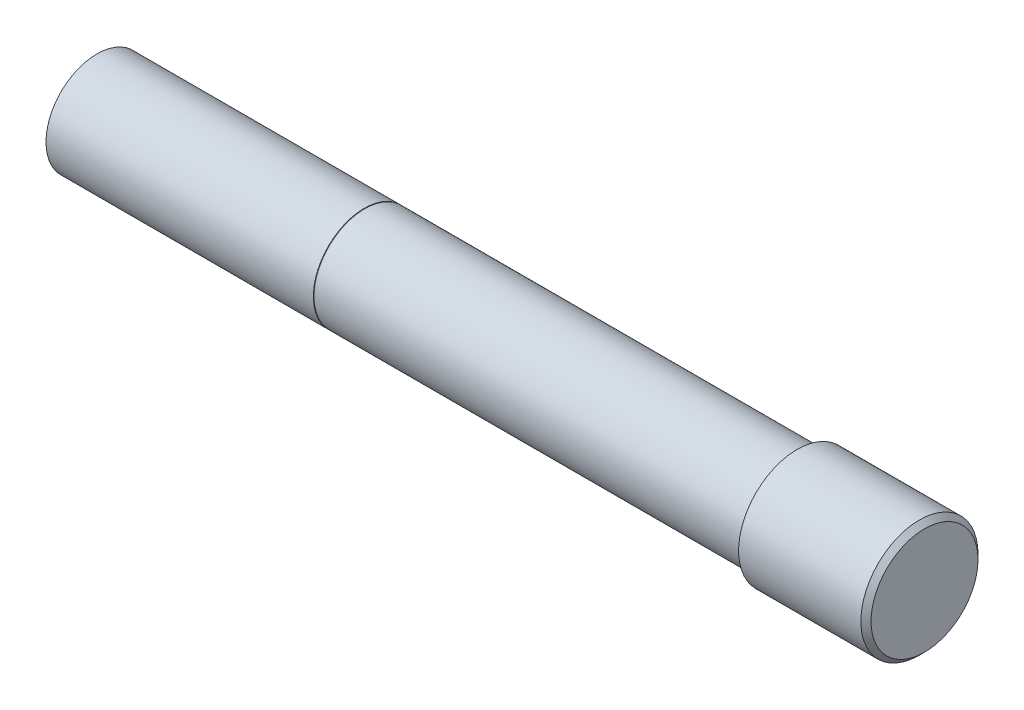
ISO-10303-21;
HEADER;
FILE_DESCRIPTION(('STEP AP214'),'2;1');
FILE_NAME('part.step','',(''),(''),'','','');
FILE_SCHEMA(('AUTOMOTIVE_DESIGN { 1 0 10303 214 1 1 1 1 }'));
ENDSEC;
DATA;
#1=APPLICATION_CONTEXT('core data for automotive mechanical design processes');
#2=APPLICATION_PROTOCOL_DEFINITION('international standard','automotive_design',2000,#1);
#3=PRODUCT_CONTEXT('',#1,'mechanical');
#4=PRODUCT('Part','Part','',(#3));
#5=PRODUCT_RELATED_PRODUCT_CATEGORY('part','',(#4));
#6=PRODUCT_DEFINITION_FORMATION('','',#4);
#7=PRODUCT_DEFINITION_CONTEXT('part definition',#1,'design');
#8=PRODUCT_DEFINITION('design','',#6,#7);
#9=PRODUCT_DEFINITION_SHAPE('','',#8);
#10=(LENGTH_UNIT() NAMED_UNIT(*) SI_UNIT(.MILLI.,.METRE.));
#11=(NAMED_UNIT(*) PLANE_ANGLE_UNIT() SI_UNIT($,.RADIAN.));
#12=(NAMED_UNIT(*) SI_UNIT($,.STERADIAN.) SOLID_ANGLE_UNIT());
#13=UNCERTAINTY_MEASURE_WITH_UNIT(LENGTH_MEASURE(1.E-05),#10,'distance_accuracy_value','');
#14=(GEOMETRIC_REPRESENTATION_CONTEXT(3) GLOBAL_UNCERTAINTY_ASSIGNED_CONTEXT((#13)) GLOBAL_UNIT_ASSIGNED_CONTEXT((#10,
#11,#12)) REPRESENTATION_CONTEXT('',''));
#15=CARTESIAN_POINT('',(0.,0.,0.));
#16=DIRECTION('',(0.,0.,1.));
#17=DIRECTION('',(1.,0.,0.));
#18=AXIS2_PLACEMENT_3D('',#15,#16,#17);
#19=CARTESIAN_POINT('',(0.,0.,0.));
#20=DIRECTION('',(1.,0.,0.));
#21=DIRECTION('',(0.,0.,-1.));
#22=AXIS2_PLACEMENT_3D('',#19,#20,#21);
#23=CYLINDRICAL_SURFACE('',#22,2.);
#24=CARTESIAN_POINT('',(11.,0.,0.));
#25=DIRECTION('',(1.,0.,0.));
#26=DIRECTION('',(0.,0.,-1.));
#27=AXIS2_PLACEMENT_3D('',#24,#25,#26);
#28=CIRCLE('',#27,2.);
#29=CARTESIAN_POINT('',(11.,0.,-2.));
#30=VERTEX_POINT('',#29);
#31=EDGE_CURVE('E64',#30,#30,#28,.T.);
#32=ORIENTED_EDGE('',*,*,#31,.F.);
#33=EDGE_LOOP('',(#32));
#34=FACE_BOUND('',#33,.T.);
#35=CARTESIAN_POINT('',(0.5,0.,0.));
#36=DIRECTION('',(-1.,0.,0.));
#37=DIRECTION('',(0.,0.,1.));
#38=AXIS2_PLACEMENT_3D('',#35,#36,#37);
#39=CIRCLE('',#38,2.);
#40=CARTESIAN_POINT('',(0.5,0.,2.));
#41=VERTEX_POINT('',#40);
#42=EDGE_CURVE('E39',#41,#41,#39,.F.);
#43=ORIENTED_EDGE('',*,*,#42,.T.);
#44=EDGE_LOOP('',(#43));
#45=FACE_BOUND('',#44,.T.);
#46=ADVANCED_FACE('F35',(#34,#45),#23,.T.);
#47=CARTESIAN_POINT('',(33.,0.,0.));
#48=DIRECTION('',(1.,0.,0.));
#49=DIRECTION('',(0.,0.,-1.));
#50=AXIS2_PLACEMENT_3D('',#47,#48,#49);
#51=PLANE('',#50);
#52=CARTESIAN_POINT('',(33.,0.,0.));
#53=DIRECTION('',(1.,0.,0.));
#54=DIRECTION('',(0.,0.,-1.));
#55=AXIS2_PLACEMENT_3D('',#52,#53,#54);
#56=CIRCLE('',#55,2.10000000000001);
#57=CARTESIAN_POINT('',(33.,0.,-2.10000000000001));
#58=VERTEX_POINT('',#57);
#59=EDGE_CURVE('E43',#58,#58,#56,.T.);
#60=ORIENTED_EDGE('',*,*,#59,.T.);
#61=EDGE_LOOP('',(#60));
#62=FACE_BOUND('',#61,.T.);
#63=ADVANCED_FACE('F82',(#62),#51,.T.);
#64=CARTESIAN_POINT('',(0.,0.,0.));
#65=DIRECTION('',(1.,0.,0.));
#66=DIRECTION('',(0.,0.,-1.));
#67=AXIS2_PLACEMENT_3D('',#64,#65,#66);
#68=CYLINDRICAL_SURFACE('',#67,2.3);
#69=CARTESIAN_POINT('',(32.8,0.,0.));
#70=DIRECTION('',(1.,0.,0.));
#71=DIRECTION('',(0.,0.,-1.));
#72=AXIS2_PLACEMENT_3D('',#69,#70,#71);
#73=CIRCLE('',#72,2.3);
#74=CARTESIAN_POINT('',(32.8,0.,-2.3));
#75=VERTEX_POINT('',#74);
#76=EDGE_CURVE('E10',#75,#75,#73,.F.);
#77=ORIENTED_EDGE('',*,*,#76,.T.);
#78=EDGE_LOOP('',(#77));
#79=FACE_BOUND('',#78,.T.);
#80=CARTESIAN_POINT('',(28.,0.,0.));
#81=DIRECTION('',(1.,0.,0.));
#82=DIRECTION('',(0.,0.,-1.));
#83=AXIS2_PLACEMENT_3D('',#80,#81,#82);
#84=CIRCLE('',#83,2.3);
#85=CARTESIAN_POINT('',(28.,0.,-2.3));
#86=VERTEX_POINT('',#85);
#87=EDGE_CURVE('E47',#86,#86,#84,.T.);
#88=ORIENTED_EDGE('',*,*,#87,.T.);
#89=EDGE_LOOP('',(#88));
#90=FACE_BOUND('',#89,.T.);
#91=ADVANCED_FACE('F87',(#79,#90),#68,.T.);
#92=CARTESIAN_POINT('',(28.,0.,-2.3));
#93=DIRECTION('',(-1.,0.,0.));
#94=DIRECTION('',(0.,0.,1.));
#95=AXIS2_PLACEMENT_3D('',#92,#93,#94);
#96=PLANE('',#95);
#97=CARTESIAN_POINT('',(28.,0.,0.));
#98=DIRECTION('',(1.,0.,0.));
#99=DIRECTION('',(0.,0.,-1.));
#100=AXIS2_PLACEMENT_3D('',#97,#98,#99);
#101=CIRCLE('',#100,2.);
#102=CARTESIAN_POINT('',(28.,0.,-2.));
#103=VERTEX_POINT('',#102);
#104=EDGE_CURVE('E52',#103,#103,#101,.T.);
#105=ORIENTED_EDGE('',*,*,#104,.T.);
#106=EDGE_LOOP('',(#105));
#107=FACE_BOUND('',#106,.T.);
#108=ORIENTED_EDGE('',*,*,#87,.F.);
#109=EDGE_LOOP('',(#108));
#110=FACE_BOUND('',#109,.T.);
#111=ADVANCED_FACE('F103',(#107,#110),#96,.T.);
#112=CARTESIAN_POINT('',(0.,0.,0.));
#113=DIRECTION('',(1.,0.,0.));
#114=DIRECTION('',(0.,0.,-1.));
#115=AXIS2_PLACEMENT_3D('',#112,#113,#114);
#116=CYLINDRICAL_SURFACE('',#115,2.);
#117=CARTESIAN_POINT('',(11.0296457270259,0.,0.));
#118=DIRECTION('',(1.,0.,0.));
#119=DIRECTION('',(0.,0.,-1.));
#120=AXIS2_PLACEMENT_3D('',#117,#118,#119);
#121=CIRCLE('',#120,2.);
#122=CARTESIAN_POINT('',(11.0296457270259,0.,-2.));
#123=VERTEX_POINT('',#122);
#124=EDGE_CURVE('E55',#123,#123,#121,.T.);
#125=ORIENTED_EDGE('',*,*,#124,.T.);
#126=EDGE_LOOP('',(#125));
#127=FACE_BOUND('',#126,.T.);
#128=ORIENTED_EDGE('',*,*,#104,.F.);
#129=EDGE_LOOP('',(#128));
#130=FACE_BOUND('',#129,.T.);
#131=ADVANCED_FACE('F99',(#127,#130),#116,.T.);
#132=CARTESIAN_POINT('',(11.0296457270259,0.,-2.));
#133=DIRECTION('',(-1.,0.,0.));
#134=DIRECTION('',(0.,0.,1.));
#135=AXIS2_PLACEMENT_3D('',#132,#133,#134);
#136=PLANE('',#135);
#137=CARTESIAN_POINT('',(11.0296457270259,0.,0.));
#138=DIRECTION('',(1.,0.,0.));
#139=DIRECTION('',(0.,0.,-1.));
#140=AXIS2_PLACEMENT_3D('',#137,#138,#139);
#141=CIRCLE('',#140,1.98197522294363);
#142=CARTESIAN_POINT('',(11.0296457270259,0.,-1.98197522294363));
#143=VERTEX_POINT('',#142);
#144=EDGE_CURVE('E58',#143,#143,#141,.T.);
#145=ORIENTED_EDGE('',*,*,#144,.T.);
#146=EDGE_LOOP('',(#145));
#147=FACE_BOUND('',#146,.T.);
#148=ORIENTED_EDGE('',*,*,#124,.F.);
#149=EDGE_LOOP('',(#148));
#150=FACE_BOUND('',#149,.T.);
#151=ADVANCED_FACE('F95',(#147,#150),#136,.T.);
#152=CARTESIAN_POINT('',(0.,0.,0.));
#153=DIRECTION('',(1.,0.,0.));
#154=DIRECTION('',(0.,0.,-1.));
#155=AXIS2_PLACEMENT_3D('',#152,#153,#154);
#156=CYLINDRICAL_SURFACE('',#155,1.98197522294363);
#157=CARTESIAN_POINT('',(11.,0.,0.));
#158=DIRECTION('',(1.,0.,0.));
#159=DIRECTION('',(0.,0.,-1.));
#160=AXIS2_PLACEMENT_3D('',#157,#158,#159);
#161=CIRCLE('',#160,1.98197522294363);
#162=CARTESIAN_POINT('',(11.,0.,-1.98197522294363));
#163=VERTEX_POINT('',#162);
#164=EDGE_CURVE('E61',#163,#163,#161,.T.);
#165=ORIENTED_EDGE('',*,*,#164,.T.);
#166=EDGE_LOOP('',(#165));
#167=FACE_BOUND('',#166,.T.);
#168=ORIENTED_EDGE('',*,*,#144,.F.);
#169=EDGE_LOOP('',(#168));
#170=FACE_BOUND('',#169,.T.);
#171=ADVANCED_FACE('F92',(#167,#170),#156,.T.);
#172=CARTESIAN_POINT('',(11.,0.,-2.));
#173=DIRECTION('',(1.,0.,0.));
#174=DIRECTION('',(0.,0.,-1.));
#175=AXIS2_PLACEMENT_3D('',#172,#173,#174);
#176=PLANE('',#175);
#177=ORIENTED_EDGE('',*,*,#31,.T.);
#178=EDGE_LOOP('',(#177));
#179=FACE_BOUND('',#178,.T.);
#180=ORIENTED_EDGE('',*,*,#164,.F.);
#181=EDGE_LOOP('',(#180));
#182=FACE_BOUND('',#181,.T.);
#183=ADVANCED_FACE('F78',(#179,#182),#176,.T.);
#184=CARTESIAN_POINT('',(33.,0.,0.));
#185=DIRECTION('',(-1.,0.,0.));
#186=DIRECTION('',(0.,0.,1.));
#187=AXIS2_PLACEMENT_3D('',#184,#185,#186);
#188=CONICAL_SURFACE('',#187,2.10000000000001,0.785398163397447);
#189=ORIENTED_EDGE('',*,*,#76,.F.);
#190=EDGE_LOOP('',(#189));
#191=FACE_BOUND('',#190,.T.);
#192=ORIENTED_EDGE('',*,*,#59,.F.);
#193=EDGE_LOOP('',(#192));
#194=FACE_BOUND('',#193,.T.);
#195=ADVANCED_FACE('F37',(#191,#194),#188,.T.);
#196=CARTESIAN_POINT('',(0.5,0.,0.));
#197=DIRECTION('',(-1.,0.,0.));
#198=DIRECTION('',(0.,0.,1.));
#199=AXIS2_PLACEMENT_3D('',#196,#197,#198);
#200=PLANE('',#199);
#201=ORIENTED_EDGE('',*,*,#42,.F.);
#202=EDGE_LOOP('',(#201));
#203=FACE_BOUND('',#202,.T.);
#204=ADVANCED_FACE('F72',(#203),#200,.T.);
#205=CLOSED_SHELL('',(#46,#63,#91,#111,#131,#151,#171,#183,#195,#204));
#206=MANIFOLD_SOLID_BREP('B2',#205);
#207=ADVANCED_BREP_SHAPE_REPRESENTATION('',(#18,#206),#14);
#208=SHAPE_DEFINITION_REPRESENTATION(#9,#207);
ENDSEC;
END-ISO-10303-21;
